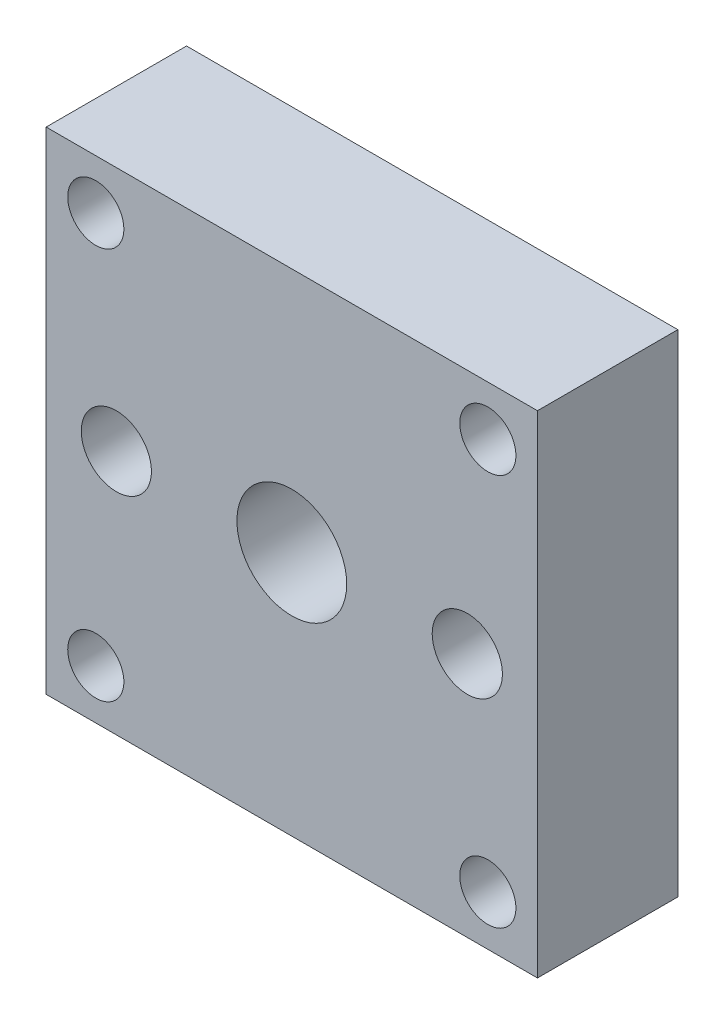
ISO-10303-21;
HEADER;
FILE_DESCRIPTION(('STEP AP214'),'2;1');
FILE_NAME('part.step','',(''),(''),'','','');
FILE_SCHEMA(('AUTOMOTIVE_DESIGN { 1 0 10303 214 1 1 1 1 }'));
ENDSEC;
DATA;
#1=APPLICATION_CONTEXT('core data for automotive mechanical design processes');
#2=APPLICATION_PROTOCOL_DEFINITION('international standard','automotive_design',2000,#1);
#3=PRODUCT_CONTEXT('',#1,'mechanical');
#4=PRODUCT('Part','Part','',(#3));
#5=PRODUCT_RELATED_PRODUCT_CATEGORY('part','',(#4));
#6=PRODUCT_DEFINITION_FORMATION('','',#4);
#7=PRODUCT_DEFINITION_CONTEXT('part definition',#1,'design');
#8=PRODUCT_DEFINITION('design','',#6,#7);
#9=PRODUCT_DEFINITION_SHAPE('','',#8);
#10=(LENGTH_UNIT() NAMED_UNIT(*) SI_UNIT(.MILLI.,.METRE.));
#11=(NAMED_UNIT(*) PLANE_ANGLE_UNIT() SI_UNIT($,.RADIAN.));
#12=(NAMED_UNIT(*) SI_UNIT($,.STERADIAN.) SOLID_ANGLE_UNIT());
#13=UNCERTAINTY_MEASURE_WITH_UNIT(LENGTH_MEASURE(1.E-05),#10,'distance_accuracy_value','');
#14=(GEOMETRIC_REPRESENTATION_CONTEXT(3) GLOBAL_UNCERTAINTY_ASSIGNED_CONTEXT((#13)) GLOBAL_UNIT_ASSIGNED_CONTEXT((#10,
#11,#12)) REPRESENTATION_CONTEXT('',''));
#15=CARTESIAN_POINT('',(0.,0.,0.));
#16=DIRECTION('',(0.,0.,1.));
#17=DIRECTION('',(1.,0.,0.));
#18=AXIS2_PLACEMENT_3D('',#15,#16,#17);
#19=CARTESIAN_POINT('',(0.,0.,10.));
#20=DIRECTION('',(0.,0.,1.));
#21=DIRECTION('',(1.,0.,0.));
#22=AXIS2_PLACEMENT_3D('',#19,#20,#21);
#23=PLANE('',#22);
#24=CARTESIAN_POINT('',(-4.46806206231328,-5.05880735241497,10.));
#25=DIRECTION('',(0.,0.,1.));
#26=DIRECTION('',(1.,0.,0.));
#27=AXIS2_PLACEMENT_3D('',#24,#25,#26);
#28=CIRCLE('',#27,2.5);
#29=CARTESIAN_POINT('',(-1.96806206231327,-5.05880735241497,10.));
#30=VERTEX_POINT('',#29);
#31=EDGE_CURVE('E139',#30,#30,#28,.T.);
#32=ORIENTED_EDGE('',*,*,#31,.F.);
#33=EDGE_LOOP('',(#32));
#34=FACE_BOUND('',#33,.T.);
#35=CARTESIAN_POINT('',(-5.93252815638054,-19.0232734464822,10.));
#36=DIRECTION('',(0.,0.,1.));
#37=DIRECTION('',(-1.,0.,0.));
#38=AXIS2_PLACEMENT_3D('',#35,#36,#37);
#39=CIRCLE('',#38,2.);
#40=CARTESIAN_POINT('',(-7.93252815638055,-19.0232734464822,10.));
#41=VERTEX_POINT('',#40);
#42=EDGE_CURVE('E127',#41,#41,#39,.T.);
#43=ORIENTED_EDGE('',*,*,#42,.F.);
#44=EDGE_LOOP('',(#43));
#45=FACE_BOUND('',#44,.T.);
#46=CARTESIAN_POINT('',(21.996404031754,-19.0232734464822,10.));
#47=DIRECTION('',(0.,0.,1.));
#48=DIRECTION('',(1.,0.,0.));
#49=AXIS2_PLACEMENT_3D('',#46,#47,#48);
#50=CIRCLE('',#49,2.);
#51=CARTESIAN_POINT('',(23.996404031754,-19.0232734464822,10.));
#52=VERTEX_POINT('',#51);
#53=EDGE_CURVE('E115',#52,#52,#50,.T.);
#54=ORIENTED_EDGE('',*,*,#53,.F.);
#55=EDGE_LOOP('',(#54));
#56=FACE_BOUND('',#55,.T.);
#57=DIRECTION('',(0.,-1.,0.));
#58=VECTOR('',#57,1.);
#59=CARTESIAN_POINT('',(-9.46806206231327,12.441192647585,10.));
#60=LINE('',#59,#58);
#61=CARTESIAN_POINT('',(-9.46806206231327,12.441192647585,10.));
#62=VERTEX_POINT('',#61);
#63=CARTESIAN_POINT('',(-9.46806206231327,-22.558807352415,10.));
#64=VERTEX_POINT('',#63);
#65=EDGE_CURVE('E85',#62,#64,#60,.T.);
#66=ORIENTED_EDGE('',*,*,#65,.T.);
#67=DIRECTION('',(1.,0.,0.));
#68=VECTOR('',#67,1.);
#69=CARTESIAN_POINT('',(-9.46806206231327,-22.558807352415,10.));
#70=LINE('',#69,#68);
#71=CARTESIAN_POINT('',(25.5319379376867,-22.558807352415,10.));
#72=VERTEX_POINT('',#71);
#73=EDGE_CURVE('E80',#64,#72,#70,.T.);
#74=ORIENTED_EDGE('',*,*,#73,.T.);
#75=DIRECTION('',(0.,1.,0.));
#76=VECTOR('',#75,1.);
#77=CARTESIAN_POINT('',(25.5319379376867,12.441192647585,10.));
#78=LINE('',#77,#76);
#79=CARTESIAN_POINT('',(25.5319379376867,12.441192647585,10.));
#80=VERTEX_POINT('',#79);
#81=EDGE_CURVE('E83',#72,#80,#78,.T.);
#82=ORIENTED_EDGE('',*,*,#81,.T.);
#83=DIRECTION('',(-1.,0.,0.));
#84=VECTOR('',#83,1.);
#85=CARTESIAN_POINT('',(-9.46806206231327,12.441192647585,10.));
#86=LINE('',#85,#84);
#87=EDGE_CURVE('E50',#80,#62,#86,.T.);
#88=ORIENTED_EDGE('',*,*,#87,.T.);
#89=EDGE_LOOP('',(#66,#74,#82,#88));
#90=FACE_BOUND('',#89,.T.);
#91=CARTESIAN_POINT('',(8.03193793768673,-5.05880735241497,10.));
#92=DIRECTION('',(0.,0.,1.));
#93=DIRECTION('',(1.,0.,0.));
#94=AXIS2_PLACEMENT_3D('',#91,#92,#93);
#95=CIRCLE('',#94,3.91);
#96=CARTESIAN_POINT('',(11.9419379376867,-5.05880735241497,10.));
#97=VERTEX_POINT('',#96);
#98=EDGE_CURVE('E100',#97,#97,#95,.T.);
#99=ORIENTED_EDGE('',*,*,#98,.F.);
#100=EDGE_LOOP('',(#99));
#101=FACE_BOUND('',#100,.T.);
#102=CARTESIAN_POINT('',(21.996404031754,8.9056587416523,10.));
#103=DIRECTION('',(0.,0.,1.));
#104=DIRECTION('',(-1.,0.,0.));
#105=AXIS2_PLACEMENT_3D('',#102,#103,#104);
#106=CIRCLE('',#105,2.);
#107=CARTESIAN_POINT('',(19.996404031754,8.9056587416523,10.));
#108=VERTEX_POINT('',#107);
#109=EDGE_CURVE('E121',#108,#108,#106,.T.);
#110=ORIENTED_EDGE('',*,*,#109,.F.);
#111=EDGE_LOOP('',(#110));
#112=FACE_BOUND('',#111,.T.);
#113=CARTESIAN_POINT('',(-5.93252815638053,8.9056587416523,10.));
#114=DIRECTION('',(0.,0.,1.));
#115=DIRECTION('',(1.,0.,0.));
#116=AXIS2_PLACEMENT_3D('',#113,#114,#115);
#117=CIRCLE('',#116,2.);
#118=CARTESIAN_POINT('',(-3.93252815638053,8.9056587416523,10.));
#119=VERTEX_POINT('',#118);
#120=EDGE_CURVE('E133',#119,#119,#117,.T.);
#121=ORIENTED_EDGE('',*,*,#120,.F.);
#122=EDGE_LOOP('',(#121));
#123=FACE_BOUND('',#122,.T.);
#124=CARTESIAN_POINT('',(20.5319379376867,-5.05880735241497,10.));
#125=DIRECTION('',(0.,0.,1.));
#126=DIRECTION('',(-1.,0.,0.));
#127=AXIS2_PLACEMENT_3D('',#124,#125,#126);
#128=CIRCLE('',#127,2.5);
#129=CARTESIAN_POINT('',(18.0319379376867,-5.05880735241497,10.));
#130=VERTEX_POINT('',#129);
#131=EDGE_CURVE('E145',#130,#130,#128,.T.);
#132=ORIENTED_EDGE('',*,*,#131,.F.);
#133=EDGE_LOOP('',(#132));
#134=FACE_BOUND('',#133,.T.);
#135=ADVANCED_FACE('F33',(#34,#45,#56,#90,#101,#112,#123,#134),#23,.T.);
#136=CARTESIAN_POINT('',(0.,0.,0.));
#137=DIRECTION('',(0.,0.,1.));
#138=DIRECTION('',(1.,0.,0.));
#139=AXIS2_PLACEMENT_3D('',#136,#137,#138);
#140=PLANE('',#139);
#141=DIRECTION('',(0.,-1.,0.));
#142=VECTOR('',#141,1.);
#143=CARTESIAN_POINT('',(-9.46806206231327,12.441192647585,0.));
#144=LINE('',#143,#142);
#145=CARTESIAN_POINT('',(-9.46806206231327,12.441192647585,0.));
#146=VERTEX_POINT('',#145);
#147=CARTESIAN_POINT('',(-9.46806206231327,-22.558807352415,0.));
#148=VERTEX_POINT('',#147);
#149=EDGE_CURVE('E97',#146,#148,#144,.T.);
#150=ORIENTED_EDGE('',*,*,#149,.F.);
#151=DIRECTION('',(-1.,0.,0.));
#152=VECTOR('',#151,1.);
#153=CARTESIAN_POINT('',(-9.46806206231327,12.441192647585,0.));
#154=LINE('',#153,#152);
#155=CARTESIAN_POINT('',(25.5319379376867,12.441192647585,0.));
#156=VERTEX_POINT('',#155);
#157=EDGE_CURVE('E73',#156,#146,#154,.T.);
#158=ORIENTED_EDGE('',*,*,#157,.F.);
#159=DIRECTION('',(0.,1.,0.));
#160=VECTOR('',#159,1.);
#161=CARTESIAN_POINT('',(25.5319379376867,12.441192647585,0.));
#162=LINE('',#161,#160);
#163=CARTESIAN_POINT('',(25.5319379376867,-22.558807352415,0.));
#164=VERTEX_POINT('',#163);
#165=EDGE_CURVE('E67',#164,#156,#162,.T.);
#166=ORIENTED_EDGE('',*,*,#165,.F.);
#167=DIRECTION('',(1.,0.,0.));
#168=VECTOR('',#167,1.);
#169=CARTESIAN_POINT('',(-9.46806206231327,-22.558807352415,0.));
#170=LINE('',#169,#168);
#171=EDGE_CURVE('E89',#148,#164,#170,.T.);
#172=ORIENTED_EDGE('',*,*,#171,.F.);
#173=EDGE_LOOP('',(#150,#158,#166,#172));
#174=FACE_BOUND('',#173,.T.);
#175=CARTESIAN_POINT('',(8.03193793768673,-5.05880735241497,0.));
#176=DIRECTION('',(0.,0.,1.));
#177=DIRECTION('',(1.,0.,0.));
#178=AXIS2_PLACEMENT_3D('',#175,#176,#177);
#179=CIRCLE('',#178,3.91);
#180=CARTESIAN_POINT('',(11.9419379376867,-5.05880735241497,0.));
#181=VERTEX_POINT('',#180);
#182=EDGE_CURVE('E112',#181,#181,#179,.T.);
#183=ORIENTED_EDGE('',*,*,#182,.T.);
#184=EDGE_LOOP('',(#183));
#185=FACE_BOUND('',#184,.T.);
#186=CARTESIAN_POINT('',(21.996404031754,-19.0232734464822,0.));
#187=DIRECTION('',(0.,0.,1.));
#188=DIRECTION('',(1.,0.,0.));
#189=AXIS2_PLACEMENT_3D('',#186,#187,#188);
#190=CIRCLE('',#189,2.);
#191=CARTESIAN_POINT('',(23.996404031754,-19.0232734464822,0.));
#192=VERTEX_POINT('',#191);
#193=EDGE_CURVE('E118',#192,#192,#190,.T.);
#194=ORIENTED_EDGE('',*,*,#193,.T.);
#195=EDGE_LOOP('',(#194));
#196=FACE_BOUND('',#195,.T.);
#197=CARTESIAN_POINT('',(21.996404031754,8.9056587416523,0.));
#198=DIRECTION('',(0.,0.,1.));
#199=DIRECTION('',(-1.,0.,0.));
#200=AXIS2_PLACEMENT_3D('',#197,#198,#199);
#201=CIRCLE('',#200,2.);
#202=CARTESIAN_POINT('',(19.996404031754,8.9056587416523,0.));
#203=VERTEX_POINT('',#202);
#204=EDGE_CURVE('E124',#203,#203,#201,.T.);
#205=ORIENTED_EDGE('',*,*,#204,.T.);
#206=EDGE_LOOP('',(#205));
#207=FACE_BOUND('',#206,.T.);
#208=CARTESIAN_POINT('',(-5.93252815638054,-19.0232734464822,0.));
#209=DIRECTION('',(0.,0.,1.));
#210=DIRECTION('',(-1.,0.,0.));
#211=AXIS2_PLACEMENT_3D('',#208,#209,#210);
#212=CIRCLE('',#211,2.);
#213=CARTESIAN_POINT('',(-7.93252815638055,-19.0232734464822,0.));
#214=VERTEX_POINT('',#213);
#215=EDGE_CURVE('E130',#214,#214,#212,.T.);
#216=ORIENTED_EDGE('',*,*,#215,.T.);
#217=EDGE_LOOP('',(#216));
#218=FACE_BOUND('',#217,.T.);
#219=CARTESIAN_POINT('',(-5.93252815638053,8.9056587416523,0.));
#220=DIRECTION('',(0.,0.,1.));
#221=DIRECTION('',(1.,0.,0.));
#222=AXIS2_PLACEMENT_3D('',#219,#220,#221);
#223=CIRCLE('',#222,2.);
#224=CARTESIAN_POINT('',(-3.93252815638053,8.9056587416523,0.));
#225=VERTEX_POINT('',#224);
#226=EDGE_CURVE('E136',#225,#225,#223,.T.);
#227=ORIENTED_EDGE('',*,*,#226,.T.);
#228=EDGE_LOOP('',(#227));
#229=FACE_BOUND('',#228,.T.);
#230=CARTESIAN_POINT('',(-4.46806206231328,-5.05880735241497,0.));
#231=DIRECTION('',(0.,0.,1.));
#232=DIRECTION('',(1.,0.,0.));
#233=AXIS2_PLACEMENT_3D('',#230,#231,#232);
#234=CIRCLE('',#233,2.5);
#235=CARTESIAN_POINT('',(-1.96806206231327,-5.05880735241497,0.));
#236=VERTEX_POINT('',#235);
#237=EDGE_CURVE('E142',#236,#236,#234,.T.);
#238=ORIENTED_EDGE('',*,*,#237,.T.);
#239=EDGE_LOOP('',(#238));
#240=FACE_BOUND('',#239,.T.);
#241=CARTESIAN_POINT('',(20.5319379376867,-5.05880735241497,0.));
#242=DIRECTION('',(0.,0.,1.));
#243=DIRECTION('',(-1.,0.,0.));
#244=AXIS2_PLACEMENT_3D('',#241,#242,#243);
#245=CIRCLE('',#244,2.5);
#246=CARTESIAN_POINT('',(18.0319379376867,-5.05880735241497,0.));
#247=VERTEX_POINT('',#246);
#248=EDGE_CURVE('E148',#247,#247,#245,.T.);
#249=ORIENTED_EDGE('',*,*,#248,.T.);
#250=EDGE_LOOP('',(#249));
#251=FACE_BOUND('',#250,.T.);
#252=ADVANCED_FACE('F108',(#174,#185,#196,#207,#218,#229,#240,#251),#140,.F.);
#253=CARTESIAN_POINT('',(-9.46806206231327,12.441192647585,10.));
#254=DIRECTION('',(1.,0.,0.));
#255=DIRECTION('',(0.,0.,-1.));
#256=AXIS2_PLACEMENT_3D('',#253,#254,#255);
#257=PLANE('',#256);
#258=ORIENTED_EDGE('',*,*,#149,.T.);
#259=DIRECTION('',(0.,0.,-1.));
#260=VECTOR('',#259,1.);
#261=CARTESIAN_POINT('',(-9.46806206231327,-22.558807352415,10.));
#262=LINE('',#261,#260);
#263=EDGE_CURVE('E11',#64,#148,#262,.T.);
#264=ORIENTED_EDGE('',*,*,#263,.F.);
#265=ORIENTED_EDGE('',*,*,#65,.F.);
#266=DIRECTION('',(0.,0.,-1.));
#267=VECTOR('',#266,1.);
#268=CARTESIAN_POINT('',(-9.46806206231327,12.441192647585,10.));
#269=LINE('',#268,#267);
#270=EDGE_CURVE('E93',#62,#146,#269,.T.);
#271=ORIENTED_EDGE('',*,*,#270,.T.);
#272=EDGE_LOOP('',(#258,#264,#265,#271));
#273=FACE_BOUND('',#272,.T.);
#274=ADVANCED_FACE('F35',(#273),#257,.F.);
#275=CARTESIAN_POINT('',(-9.46806206231327,-22.558807352415,10.));
#276=DIRECTION('',(0.,1.,0.));
#277=DIRECTION('',(0.,0.,1.));
#278=AXIS2_PLACEMENT_3D('',#275,#276,#277);
#279=PLANE('',#278);
#280=ORIENTED_EDGE('',*,*,#171,.T.);
#281=DIRECTION('',(0.,0.,-1.));
#282=VECTOR('',#281,1.);
#283=CARTESIAN_POINT('',(25.5319379376867,-22.558807352415,10.));
#284=LINE('',#283,#282);
#285=EDGE_CURVE('E42',#72,#164,#284,.T.);
#286=ORIENTED_EDGE('',*,*,#285,.F.);
#287=ORIENTED_EDGE('',*,*,#73,.F.);
#288=ORIENTED_EDGE('',*,*,#263,.T.);
#289=EDGE_LOOP('',(#280,#286,#287,#288));
#290=FACE_BOUND('',#289,.T.);
#291=ADVANCED_FACE('F88',(#290),#279,.F.);
#292=CARTESIAN_POINT('',(25.5319379376867,12.441192647585,10.));
#293=DIRECTION('',(-1.,0.,0.));
#294=DIRECTION('',(0.,0.,1.));
#295=AXIS2_PLACEMENT_3D('',#292,#293,#294);
#296=PLANE('',#295);
#297=ORIENTED_EDGE('',*,*,#165,.T.);
#298=DIRECTION('',(0.,0.,-1.));
#299=VECTOR('',#298,1.);
#300=CARTESIAN_POINT('',(25.5319379376867,12.441192647585,10.));
#301=LINE('',#300,#299);
#302=EDGE_CURVE('E90',#80,#156,#301,.T.);
#303=ORIENTED_EDGE('',*,*,#302,.F.);
#304=ORIENTED_EDGE('',*,*,#81,.F.);
#305=ORIENTED_EDGE('',*,*,#285,.T.);
#306=EDGE_LOOP('',(#297,#303,#304,#305));
#307=FACE_BOUND('',#306,.T.);
#308=ADVANCED_FACE('F91',(#307),#296,.F.);
#309=CARTESIAN_POINT('',(-9.46806206231327,12.441192647585,10.));
#310=DIRECTION('',(0.,-1.,0.));
#311=DIRECTION('',(0.,0.,-1.));
#312=AXIS2_PLACEMENT_3D('',#309,#310,#311);
#313=PLANE('',#312);
#314=ORIENTED_EDGE('',*,*,#157,.T.);
#315=ORIENTED_EDGE('',*,*,#270,.F.);
#316=ORIENTED_EDGE('',*,*,#87,.F.);
#317=ORIENTED_EDGE('',*,*,#302,.T.);
#318=EDGE_LOOP('',(#314,#315,#316,#317));
#319=FACE_BOUND('',#318,.T.);
#320=ADVANCED_FACE('F105',(#319),#313,.F.);
#321=CARTESIAN_POINT('',(8.03193793768673,-5.05880735241497,10.));
#322=DIRECTION('',(0.,0.,-1.));
#323=DIRECTION('',(-1.,0.,0.));
#324=AXIS2_PLACEMENT_3D('',#321,#322,#323);
#325=CYLINDRICAL_SURFACE('',#324,3.91);
#326=ORIENTED_EDGE('',*,*,#98,.T.);
#327=EDGE_LOOP('',(#326));
#328=FACE_BOUND('',#327,.T.);
#329=ORIENTED_EDGE('',*,*,#182,.F.);
#330=EDGE_LOOP('',(#329));
#331=FACE_BOUND('',#330,.T.);
#332=ADVANCED_FACE('F167',(#328,#331),#325,.F.);
#333=CARTESIAN_POINT('',(21.996404031754,-19.0232734464822,10.));
#334=DIRECTION('',(0.,0.,-1.));
#335=DIRECTION('',(-1.,0.,0.));
#336=AXIS2_PLACEMENT_3D('',#333,#334,#335);
#337=CYLINDRICAL_SURFACE('',#336,2.);
#338=ORIENTED_EDGE('',*,*,#53,.T.);
#339=EDGE_LOOP('',(#338));
#340=FACE_BOUND('',#339,.T.);
#341=ORIENTED_EDGE('',*,*,#193,.F.);
#342=EDGE_LOOP('',(#341));
#343=FACE_BOUND('',#342,.T.);
#344=ADVANCED_FACE('F213',(#340,#343),#337,.F.);
#345=CARTESIAN_POINT('',(21.996404031754,8.9056587416523,10.));
#346=DIRECTION('',(0.,0.,-1.));
#347=DIRECTION('',(-1.,0.,0.));
#348=AXIS2_PLACEMENT_3D('',#345,#346,#347);
#349=CYLINDRICAL_SURFACE('',#348,2.);
#350=ORIENTED_EDGE('',*,*,#109,.T.);
#351=EDGE_LOOP('',(#350));
#352=FACE_BOUND('',#351,.T.);
#353=ORIENTED_EDGE('',*,*,#204,.F.);
#354=EDGE_LOOP('',(#353));
#355=FACE_BOUND('',#354,.T.);
#356=ADVANCED_FACE('F221',(#352,#355),#349,.F.);
#357=CARTESIAN_POINT('',(-5.93252815638054,-19.0232734464822,10.));
#358=DIRECTION('',(0.,0.,-1.));
#359=DIRECTION('',(-1.,0.,0.));
#360=AXIS2_PLACEMENT_3D('',#357,#358,#359);
#361=CYLINDRICAL_SURFACE('',#360,2.);
#362=ORIENTED_EDGE('',*,*,#42,.T.);
#363=EDGE_LOOP('',(#362));
#364=FACE_BOUND('',#363,.T.);
#365=ORIENTED_EDGE('',*,*,#215,.F.);
#366=EDGE_LOOP('',(#365));
#367=FACE_BOUND('',#366,.T.);
#368=ADVANCED_FACE('F229',(#364,#367),#361,.F.);
#369=CARTESIAN_POINT('',(-5.93252815638053,8.9056587416523,10.));
#370=DIRECTION('',(0.,0.,-1.));
#371=DIRECTION('',(-1.,0.,0.));
#372=AXIS2_PLACEMENT_3D('',#369,#370,#371);
#373=CYLINDRICAL_SURFACE('',#372,2.);
#374=ORIENTED_EDGE('',*,*,#120,.T.);
#375=EDGE_LOOP('',(#374));
#376=FACE_BOUND('',#375,.T.);
#377=ORIENTED_EDGE('',*,*,#226,.F.);
#378=EDGE_LOOP('',(#377));
#379=FACE_BOUND('',#378,.T.);
#380=ADVANCED_FACE('F238',(#376,#379),#373,.F.);
#381=CARTESIAN_POINT('',(-4.46806206231328,-5.05880735241497,10.));
#382=DIRECTION('',(0.,0.,-1.));
#383=DIRECTION('',(-1.,0.,0.));
#384=AXIS2_PLACEMENT_3D('',#381,#382,#383);
#385=CYLINDRICAL_SURFACE('',#384,2.5);
#386=ORIENTED_EDGE('',*,*,#31,.T.);
#387=EDGE_LOOP('',(#386));
#388=FACE_BOUND('',#387,.T.);
#389=ORIENTED_EDGE('',*,*,#237,.F.);
#390=EDGE_LOOP('',(#389));
#391=FACE_BOUND('',#390,.T.);
#392=ADVANCED_FACE('F247',(#388,#391),#385,.F.);
#393=CARTESIAN_POINT('',(20.5319379376867,-5.05880735241497,10.));
#394=DIRECTION('',(0.,0.,-1.));
#395=DIRECTION('',(-1.,0.,0.));
#396=AXIS2_PLACEMENT_3D('',#393,#394,#395);
#397=CYLINDRICAL_SURFACE('',#396,2.5);
#398=ORIENTED_EDGE('',*,*,#131,.T.);
#399=EDGE_LOOP('',(#398));
#400=FACE_BOUND('',#399,.T.);
#401=ORIENTED_EDGE('',*,*,#248,.F.);
#402=EDGE_LOOP('',(#401));
#403=FACE_BOUND('',#402,.T.);
#404=ADVANCED_FACE('F154',(#400,#403),#397,.F.);
#405=CLOSED_SHELL('',(#135,#252,#274,#291,#308,#320,#332,#344,#356,#368,#380,#392,#404));
#406=MANIFOLD_SOLID_BREP('B2',#405);
#407=ADVANCED_BREP_SHAPE_REPRESENTATION('',(#18,#406),#14);
#408=SHAPE_DEFINITION_REPRESENTATION(#9,#407);
ENDSEC;
END-ISO-10303-21;
